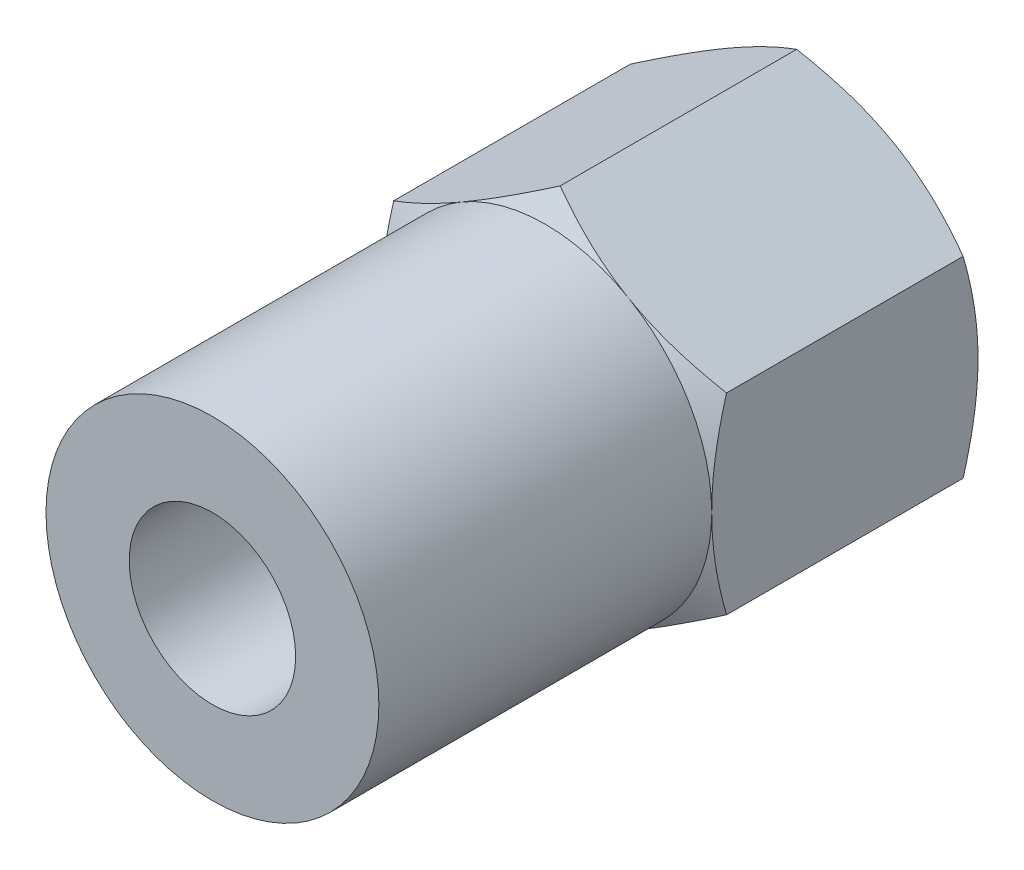
ISO-10303-21;
HEADER;
FILE_DESCRIPTION(('STEP AP214'),'2;1');
FILE_NAME('part.step','',(''),(''),'','','');
FILE_SCHEMA(('AUTOMOTIVE_DESIGN { 1 0 10303 214 1 1 1 1 }'));
ENDSEC;
DATA;
#1=APPLICATION_CONTEXT('core data for automotive mechanical design processes');
#2=APPLICATION_PROTOCOL_DEFINITION('international standard','automotive_design',2000,#1);
#3=PRODUCT_CONTEXT('',#1,'mechanical');
#4=PRODUCT('Part','Part','',(#3));
#5=PRODUCT_RELATED_PRODUCT_CATEGORY('part','',(#4));
#6=PRODUCT_DEFINITION_FORMATION('','',#4);
#7=PRODUCT_DEFINITION_CONTEXT('part definition',#1,'design');
#8=PRODUCT_DEFINITION('design','',#6,#7);
#9=PRODUCT_DEFINITION_SHAPE('','',#8);
#10=(LENGTH_UNIT() NAMED_UNIT(*) SI_UNIT(.MILLI.,.METRE.));
#11=(NAMED_UNIT(*) PLANE_ANGLE_UNIT() SI_UNIT($,.RADIAN.));
#12=(NAMED_UNIT(*) SI_UNIT($,.STERADIAN.) SOLID_ANGLE_UNIT());
#13=UNCERTAINTY_MEASURE_WITH_UNIT(LENGTH_MEASURE(1.E-05),#10,'distance_accuracy_value','');
#14=(GEOMETRIC_REPRESENTATION_CONTEXT(3) GLOBAL_UNCERTAINTY_ASSIGNED_CONTEXT((#13)) GLOBAL_UNIT_ASSIGNED_CONTEXT((#10,
#11,#12)) REPRESENTATION_CONTEXT('',''));
#15=CARTESIAN_POINT('',(0.,0.,0.));
#16=DIRECTION('',(0.,0.,1.));
#17=DIRECTION('',(1.,0.,0.));
#18=AXIS2_PLACEMENT_3D('',#15,#16,#17);
#19=CARTESIAN_POINT('',(2.5,1.44337567297407,4.));
#20=DIRECTION('',(-0.5,-0.866025403784439,0.));
#21=DIRECTION('',(0.866025403784439,-0.5,0.));
#22=AXIS2_PLACEMENT_3D('',#19,#20,#21);
#23=PLANE('',#22);
#24=DIRECTION('',(0.,0.,-1.));
#25=VECTOR('',#24,1.);
#26=CARTESIAN_POINT('',(2.5,1.44337567297407,4.));
#27=LINE('',#26,#25);
#28=CARTESIAN_POINT('',(2.5,1.44337567297407,3.7767090063074));
#29=VERTEX_POINT('',#28);
#30=CARTESIAN_POINT('',(2.5,1.44337567297407,0.223290993692598));
#31=VERTEX_POINT('',#30);
#32=EDGE_CURVE('E153',#29,#31,#27,.T.);
#33=ORIENTED_EDGE('',*,*,#32,.T.);
#34=CARTESIAN_POINT('',(2.5002,1.44326020292023,0.223357664359105));
#35=CARTESIAN_POINT('',(2.39033676526513,1.50668977106845,0.186721620107623));
#36=CARTESIAN_POINT('',(2.27952520010347,1.57066685804385,0.153402218965053));
#37=CARTESIAN_POINT('',(2.05598316653395,1.69972891130041,0.0952422855578558));
#38=CARTESIAN_POINT('',(1.94324872547161,1.7648161711947,0.0704223291477367));
#39=CARTESIAN_POINT('',(1.71917700612473,1.8941840386774,0.0317856514410509));
#40=CARTESIAN_POINT('',(1.60787420823262,1.95844473900197,0.0177117961856379));
#41=CARTESIAN_POINT('',(1.38474477253166,2.08726857876804,0.000909152352749485));
#42=CARTESIAN_POINT('',(1.27291894598577,2.15183124982667,-0.00183354879637389));
#43=CARTESIAN_POINT('',(1.06395802444848,2.27247489412634,0.00386576000805311));
#44=CARTESIAN_POINT('',(0.966791682442268,2.32857390783979,0.0109083943818612));
#45=CARTESIAN_POINT('',(0.773092050288996,2.44040644260542,0.0332314191249417));
#46=CARTESIAN_POINT('',(0.676559430340266,2.49613957671839,0.048519438440266));
#47=CARTESIAN_POINT('',(0.482460278259522,2.60820277442169,0.0867390938444189));
#48=CARTESIAN_POINT('',(0.384918318217858,2.66451865130903,0.109832776125515));
#49=CARTESIAN_POINT('',(0.191289391923913,2.77631036402774,0.162246656577911));
#50=CARTESIAN_POINT('',(0.0951999441138218,2.83178763258717,0.191554535624546));
#51=CARTESIAN_POINT('',(-0.000200000000002286,2.88686681600197,0.223357664359106));
#52=B_SPLINE_CURVE_WITH_KNOTS('',3,(#34,#35,#36,#37,#38,#39,#40,#41,#42,#43,#44,#45,#46,#47,#48,
#49,#50,#51),.UNSPECIFIED.,.F.,.F.,(4,2,2,2,2,2,2,2,4),(0.,0.396285827362226,0.793524330152049,
1.18093086852114,1.56786160134475,1.90479741793733,2.24204551660463,2.58677531536756,
2.93082800105256),.UNSPECIFIED.);
#53=CARTESIAN_POINT('',(1.25,2.1650635094611,0.));
#54=VERTEX_POINT('',#53);
#55=EDGE_CURVE('E53',#31,#54,#52,.T.);
#56=ORIENTED_EDGE('',*,*,#55,.T.);
#57=CARTESIAN_POINT('',(0.,2.88675134594813,0.223290993692599));
#58=VERTEX_POINT('',#57);
#59=EDGE_CURVE('E224',#54,#58,#52,.T.);
#60=ORIENTED_EDGE('',*,*,#59,.T.);
#61=DIRECTION('',(0.,0.,-1.));
#62=VECTOR('',#61,1.);
#63=CARTESIAN_POINT('',(0.,2.88675134594813,4.));
#64=LINE('',#63,#62);
#65=CARTESIAN_POINT('',(0.,2.88675134594813,3.7767090063074));
#66=VERTEX_POINT('',#65);
#67=EDGE_CURVE('E269',#66,#58,#64,.T.);
#68=ORIENTED_EDGE('',*,*,#67,.F.);
#69=CARTESIAN_POINT('',(-0.000200000000002395,2.88686681600197,3.77664233564089));
#70=CARTESIAN_POINT('',(0.109663234734869,2.82343724785375,3.81327837989238));
#71=CARTESIAN_POINT('',(0.220474799896523,2.75946016087834,3.84659778103495));
#72=CARTESIAN_POINT('',(0.444016833466047,2.63039810762178,3.90475771444214));
#73=CARTESIAN_POINT('',(0.556751274528385,2.5653108477275,3.92957767085226));
#74=CARTESIAN_POINT('',(0.780822993875266,2.43594298024479,3.96821434855895));
#75=CARTESIAN_POINT('',(0.892125791767374,2.37168227992023,3.98228820381436));
#76=CARTESIAN_POINT('',(1.11525522746833,2.24285844015415,3.99909084764725));
#77=CARTESIAN_POINT('',(1.22708105401422,2.17829576909553,4.00183354879637));
#78=CARTESIAN_POINT('',(1.43604197555152,2.05765212479586,3.99613423999195));
#79=CARTESIAN_POINT('',(1.53320831755773,2.0015531110824,3.98909160561814));
#80=CARTESIAN_POINT('',(1.726907949711,1.88972057631678,3.96676858087506));
#81=CARTESIAN_POINT('',(1.82344056965973,1.8339874422038,3.95148056155973));
#82=CARTESIAN_POINT('',(2.01753972174047,1.7219242445005,3.91326090615558));
#83=CARTESIAN_POINT('',(2.11508168178214,1.66560836761316,3.89016722387449));
#84=CARTESIAN_POINT('',(2.30871060807608,1.55381665489446,3.83775334342209));
#85=CARTESIAN_POINT('',(2.40480005588617,1.49833938633502,3.80844546437545));
#86=CARTESIAN_POINT('',(2.5002,1.44326020292023,3.77664233564089));
#87=B_SPLINE_CURVE_WITH_KNOTS('',3,(#69,#70,#71,#72,#73,#74,#75,#76,#77,#78,#79,#80,#81,#82,#83,
#84,#85,#86),.UNSPECIFIED.,.F.,.F.,(4,2,2,2,2,2,2,2,4),(0.,0.396285827362226,0.793524330152049,
1.18093086852114,1.56786160134475,1.90479741793733,2.24204551660463,2.58677531536756,
2.93082800105256),.UNSPECIFIED.);
#88=CARTESIAN_POINT('',(1.25,2.1650635094611,4.));
#89=VERTEX_POINT('',#88);
#90=EDGE_CURVE('E293',#66,#89,#87,.T.);
#91=ORIENTED_EDGE('',*,*,#90,.T.);
#92=EDGE_CURVE('E147',#89,#29,#87,.T.);
#93=ORIENTED_EDGE('',*,*,#92,.T.);
#94=EDGE_LOOP('',(#33,#56,#60,#68,#91,#93));
#95=FACE_BOUND('',#94,.T.);
#96=ADVANCED_FACE('F32',(#95),#23,.F.);
#97=CARTESIAN_POINT('',(0.,2.88675134594813,4.));
#98=DIRECTION('',(0.5,-0.866025403784439,0.));
#99=DIRECTION('',(0.866025403784439,0.5,0.));
#100=AXIS2_PLACEMENT_3D('',#97,#98,#99);
#101=PLANE('',#100);
#102=ORIENTED_EDGE('',*,*,#67,.T.);
#103=CARTESIAN_POINT('',(0.000199999999997659,2.88686681600197,0.223357664359106));
#104=CARTESIAN_POINT('',(-0.109663234734873,2.82343724785375,0.186721620107624));
#105=CARTESIAN_POINT('',(-0.220474799896528,2.75946016087834,0.153402218965055));
#106=CARTESIAN_POINT('',(-0.444016833466051,2.63039810762178,0.095242285557857));
#107=CARTESIAN_POINT('',(-0.55675127452839,2.5653108477275,0.0704223291477378));
#108=CARTESIAN_POINT('',(-0.78082299387527,2.43594298024479,0.031785651441052));
#109=CARTESIAN_POINT('',(-0.892125791767378,2.37168227992023,0.0177117961856391));
#110=CARTESIAN_POINT('',(-1.11525522746833,2.24285844015415,0.000909152352750564));
#111=CARTESIAN_POINT('',(-1.22708105401423,2.17829576909553,-0.00183354879637306));
#112=CARTESIAN_POINT('',(-1.43604197555152,2.05765212479586,0.0038657600080538));
#113=CARTESIAN_POINT('',(-1.53320831755773,2.0015531110824,0.0109083943818619));
#114=CARTESIAN_POINT('',(-1.726907949711,1.88972057631678,0.0332314191249424));
#115=CARTESIAN_POINT('',(-1.82344056965973,1.8339874422038,0.0485194384402668));
#116=CARTESIAN_POINT('',(-2.01753972174047,1.7219242445005,0.0867390938444195));
#117=CARTESIAN_POINT('',(-2.11508168178214,1.66560836761316,0.109832776125516));
#118=CARTESIAN_POINT('',(-2.30871060807608,1.55381665489446,0.162246656577911));
#119=CARTESIAN_POINT('',(-2.40480005588617,1.49833938633502,0.191554535624546));
#120=CARTESIAN_POINT('',(-2.5002,1.44326020292023,0.223357664359106));
#121=B_SPLINE_CURVE_WITH_KNOTS('',3,(#103,#104,#105,#106,#107,#108,#109,#110,#111,#112,#113,
#114,#115,#116,#117,#118,#119,#120),.UNSPECIFIED.,.F.,.F.,(4,2,2,2,2,2,2,2,4),(0.,
0.396285827362226,0.79352433015205,1.18093086852114,1.56786160134475,1.90479741793733,
2.24204551660462,2.58677531536756,2.93082800105256),.UNSPECIFIED.);
#122=CARTESIAN_POINT('',(-1.25,2.1650635094611,0.));
#123=VERTEX_POINT('',#122);
#124=EDGE_CURVE('E222',#58,#123,#121,.T.);
#125=ORIENTED_EDGE('',*,*,#124,.T.);
#126=CARTESIAN_POINT('',(-2.5,1.44337567297407,0.223290993692599));
#127=VERTEX_POINT('',#126);
#128=EDGE_CURVE('E217',#123,#127,#121,.T.);
#129=ORIENTED_EDGE('',*,*,#128,.T.);
#130=DIRECTION('',(0.,0.,-1.));
#131=VECTOR('',#130,1.);
#132=CARTESIAN_POINT('',(-2.5,1.44337567297407,4.));
#133=LINE('',#132,#131);
#134=CARTESIAN_POINT('',(-2.5,1.44337567297407,3.7767090063074));
#135=VERTEX_POINT('',#134);
#136=EDGE_CURVE('E266',#135,#127,#133,.T.);
#137=ORIENTED_EDGE('',*,*,#136,.F.);
#138=CARTESIAN_POINT('',(-2.5002,1.44326020292023,3.77664233564089));
#139=CARTESIAN_POINT('',(-2.39033676526513,1.50668977106845,3.81327837989238));
#140=CARTESIAN_POINT('',(-2.27952520010347,1.57066685804385,3.84659778103495));
#141=CARTESIAN_POINT('',(-2.05598316653395,1.69972891130041,3.90475771444214));
#142=CARTESIAN_POINT('',(-1.94324872547161,1.7648161711947,3.92957767085226));
#143=CARTESIAN_POINT('',(-1.71917700612473,1.8941840386774,3.96821434855895));
#144=CARTESIAN_POINT('',(-1.60787420823262,1.95844473900197,3.98228820381436));
#145=CARTESIAN_POINT('',(-1.38474477253167,2.08726857876804,3.99909084764725));
#146=CARTESIAN_POINT('',(-1.27291894598577,2.15183124982667,4.00183354879637));
#147=CARTESIAN_POINT('',(-1.06395802444848,2.27247489412634,3.99613423999195));
#148=CARTESIAN_POINT('',(-0.96679168244227,2.32857390783979,3.98909160561814));
#149=CARTESIAN_POINT('',(-0.773092050288999,2.44040644260542,3.96676858087506));
#150=CARTESIAN_POINT('',(-0.676559430340269,2.4961395767184,3.95148056155973));
#151=CARTESIAN_POINT('',(-0.482460278259526,2.60820277442169,3.91326090615558));
#152=CARTESIAN_POINT('',(-0.384918318217861,2.66451865130903,3.89016722387448));
#153=CARTESIAN_POINT('',(-0.191289391923917,2.77631036402774,3.83775334342209));
#154=CARTESIAN_POINT('',(-0.0951999441138267,2.83178763258717,3.80844546437545));
#155=CARTESIAN_POINT('',(0.000199999999997446,2.88686681600197,3.77664233564089));
#156=B_SPLINE_CURVE_WITH_KNOTS('',3,(#138,#139,#140,#141,#142,#143,#144,#145,#146,#147,#148,
#149,#150,#151,#152,#153,#154,#155),.UNSPECIFIED.,.F.,.F.,(4,2,2,2,2,2,2,2,4),(0.,
0.396285827362226,0.793524330152049,1.18093086852114,1.56786160134475,1.90479741793733,
2.24204551660462,2.58677531536756,2.93082800105256),.UNSPECIFIED.);
#157=CARTESIAN_POINT('',(-1.25,2.1650635094611,4.));
#158=VERTEX_POINT('',#157);
#159=EDGE_CURVE('E243',#135,#158,#156,.T.);
#160=ORIENTED_EDGE('',*,*,#159,.T.);
#161=EDGE_CURVE('E236',#158,#66,#156,.T.);
#162=ORIENTED_EDGE('',*,*,#161,.T.);
#163=EDGE_LOOP('',(#102,#125,#129,#137,#160,#162));
#164=FACE_BOUND('',#163,.T.);
#165=ADVANCED_FACE('F228',(#164),#101,.F.);
#166=CARTESIAN_POINT('',(-2.5,1.44337567297407,4.));
#167=DIRECTION('',(1.,0.,0.));
#168=DIRECTION('',(0.,1.,0.));
#169=AXIS2_PLACEMENT_3D('',#166,#167,#168);
#170=PLANE('',#169);
#171=ORIENTED_EDGE('',*,*,#136,.T.);
#172=CARTESIAN_POINT('',(-2.5,-3.82804588606159,1.19631719462706));
#173=CARTESIAN_POINT('',(-2.5,-3.71828171828268,1.1432730821246));
#174=CARTESIAN_POINT('',(-2.5,-3.60825803181684,1.0907562718294));
#175=CARTESIAN_POINT('',(-2.5,-3.38755129984202,0.987078574405219));
#176=CARTESIAN_POINT('',(-2.5,-3.27686814418247,0.935917922039251));
#177=CARTESIAN_POINT('',(-2.5,-3.05410425049089,0.834984342017556));
#178=CARTESIAN_POINT('',(-2.5,-2.94201913932292,0.785221031167754));
#179=CARTESIAN_POINT('',(-2.5,-2.71692767582903,0.687831863773547));
#180=CARTESIAN_POINT('',(-2.5,-2.60392137188689,0.640205895813446));
#181=CARTESIAN_POINT('',(-2.5,-2.37540490571202,0.547094350647382));
#182=CARTESIAN_POINT('',(-2.5,-2.25988103642781,0.501642229090351));
#183=CARTESIAN_POINT('',(-2.5,-2.02747068367306,0.414297786395571));
#184=CARTESIAN_POINT('',(-2.5,-1.91058405024255,0.37240586131129));
#185=CARTESIAN_POINT('',(-2.5,-1.67550228123859,0.293307436338151));
#186=CARTESIAN_POINT('',(-2.5,-1.55731053192955,0.256090975253657));
#187=CARTESIAN_POINT('',(-2.5,-1.31924678242158,0.187552148791344));
#188=CARTESIAN_POINT('',(-2.5,-1.19937532651053,0.156227919489701));
#189=CARTESIAN_POINT('',(-2.5,-0.957870273262473,0.100994259980165));
#190=CARTESIAN_POINT('',(-2.5,-0.836236215486563,0.0770868051605593));
#191=CARTESIAN_POINT('',(-2.5,-0.591501610534912,0.0382963836731118));
#192=CARTESIAN_POINT('',(-2.5,-0.468401062063662,0.0234134249781847));
#193=CARTESIAN_POINT('',(-2.5,-0.222157236207172,0.0039886185114247));
#194=CARTESIAN_POINT('',(-2.5,-0.0990192575787314,-0.000618696640384307));
#195=CARTESIAN_POINT('',(-2.5,0.147170473520896,0.000752554217982128));
#196=CARTESIAN_POINT('',(-2.5,0.270222240078052,0.00672837235162714));
#197=CARTESIAN_POINT('',(-2.5,0.480350939206174,0.0255492679731268));
#198=CARTESIAN_POINT('',(-2.5,0.567659694215581,0.035943381173778));
#199=CARTESIAN_POINT('',(-2.5,0.741602769794545,0.0613834779042062));
#200=CARTESIAN_POINT('',(-2.5,0.828236981787941,0.076430195083654));
#201=CARTESIAN_POINT('',(-2.5,1.08705718104797,0.127759568035471));
#202=CARTESIAN_POINT('',(-2.5,1.25802999101341,0.170218229281861));
#203=CARTESIAN_POINT('',(-2.5,1.5138647987597,0.243447939149863));
#204=CARTESIAN_POINT('',(-2.5,1.60006033398196,0.269821441407084));
#205=CARTESIAN_POINT('',(-2.5,1.77155175455055,0.325178116432773));
#206=CARTESIAN_POINT('',(-2.5,1.85684821570526,0.354159489224476));
#207=CARTESIAN_POINT('',(-2.5,2.02618480561257,0.414128853727964));
#208=CARTESIAN_POINT('',(-2.5,2.1102293034903,0.445104632651975));
#209=CARTESIAN_POINT('',(-2.5,2.27766622643299,0.508874299435799));
#210=CARTESIAN_POINT('',(-2.5,2.36105837219083,0.541668922113927));
#211=CARTESIAN_POINT('',(-2.5,2.44414899085243,0.575193481112136));
#212=B_SPLINE_CURVE_WITH_KNOTS('',3,(#172,#173,#174,#175,#176,#177,#178,#179,#180,#181,#182,
#183,#184,#185,#186,#187,#188,#189,#190,#191,#192,#193,#194,#195,#196,#197,#198,#199,#200,#201,
#202,#203,#204,#205,#206,#207,#208,#209,#210,#211),.UNSPECIFIED.,.F.,.F.,(4,2,2,2,2,2,2,2,2,2,2,
2,2,2,2,2,2,2,2,4),(0.,0.365732476934656,0.731527857346201,1.09941653761222,1.46728601819944,
1.83967179466915,2.2120989430543,2.58371866150581,2.95522062491226,3.32682144960045,
3.69842260258811,4.06764939320246,4.43678032932268,4.70042744974499,4.9641161647987,
5.49188604280506,5.76228478630216,6.03249830897404,6.30119088816194,6.56999282209528),.UNSPECIFIED.);
#213=CARTESIAN_POINT('',(-2.5,0.,0.));
#214=VERTEX_POINT('',#213);
#215=EDGE_CURVE('E223',#127,#214,#212,.F.);
#216=ORIENTED_EDGE('',*,*,#215,.T.);
#217=CARTESIAN_POINT('',(-2.5,-1.44337567297407,0.223290993692599));
#218=VERTEX_POINT('',#217);
#219=EDGE_CURVE('E211',#214,#218,#212,.F.);
#220=ORIENTED_EDGE('',*,*,#219,.T.);
#221=DIRECTION('',(0.,0.,-1.));
#222=VECTOR('',#221,1.);
#223=CARTESIAN_POINT('',(-2.5,-1.44337567297407,4.));
#224=LINE('',#223,#222);
#225=CARTESIAN_POINT('',(-2.5,-1.44337567297407,3.7767090063074));
#226=VERTEX_POINT('',#225);
#227=EDGE_CURVE('E263',#226,#218,#224,.T.);
#228=ORIENTED_EDGE('',*,*,#227,.F.);
#229=CARTESIAN_POINT('',(-2.5,-3.82804588606158,2.80368280537294));
#230=CARTESIAN_POINT('',(-2.5,-3.71828171828268,2.85672691787539));
#231=CARTESIAN_POINT('',(-2.5,-3.60825803181684,2.90924372817059));
#232=CARTESIAN_POINT('',(-2.5,-3.38755129984201,3.01292142559478));
#233=CARTESIAN_POINT('',(-2.5,-3.27686814418247,3.06408207796075));
#234=CARTESIAN_POINT('',(-2.5,-3.05410425049089,3.16501565798244));
#235=CARTESIAN_POINT('',(-2.5,-2.94201913932292,3.21477896883224));
#236=CARTESIAN_POINT('',(-2.5,-2.71692767582903,3.31216813622645));
#237=CARTESIAN_POINT('',(-2.5,-2.60392137188689,3.35979410418655));
#238=CARTESIAN_POINT('',(-2.5,-2.37540490571202,3.45290564935262));
#239=CARTESIAN_POINT('',(-2.5,-2.25988103642781,3.49835777090965));
#240=CARTESIAN_POINT('',(-2.5,-2.02747068367306,3.58570221360443));
#241=CARTESIAN_POINT('',(-2.5,-1.91058405024255,3.62759413868871));
#242=CARTESIAN_POINT('',(-2.5,-1.67550228123859,3.70669256366185));
#243=CARTESIAN_POINT('',(-2.5,-1.55731053192955,3.74390902474634));
#244=CARTESIAN_POINT('',(-2.5,-1.31924678242158,3.81244785120866));
#245=CARTESIAN_POINT('',(-2.5,-1.19937532651053,3.8437720805103));
#246=CARTESIAN_POINT('',(-2.5,-0.957870273262473,3.89900574001983));
#247=CARTESIAN_POINT('',(-2.5,-0.836236215486563,3.92291319483944));
#248=CARTESIAN_POINT('',(-2.5,-0.591501610534912,3.96170361632689));
#249=CARTESIAN_POINT('',(-2.5,-0.468401062063662,3.97658657502181));
#250=CARTESIAN_POINT('',(-2.5,-0.222157236207172,3.99601138148858));
#251=CARTESIAN_POINT('',(-2.5,-0.0990192575787313,4.00061869664038));
#252=CARTESIAN_POINT('',(-2.5,0.147170473520896,3.99924744578202));
#253=CARTESIAN_POINT('',(-2.5,0.270222240078052,3.99327162764837));
#254=CARTESIAN_POINT('',(-2.5,0.480350939206174,3.97445073202687));
#255=CARTESIAN_POINT('',(-2.5,0.567659694215581,3.96405661882622));
#256=CARTESIAN_POINT('',(-2.5,0.741602769794545,3.93861652209579));
#257=CARTESIAN_POINT('',(-2.5,0.828236981787941,3.92356980491635));
#258=CARTESIAN_POINT('',(-2.5,1.08705718104797,3.87224043196453));
#259=CARTESIAN_POINT('',(-2.5,1.25802999101341,3.82978177071814));
#260=CARTESIAN_POINT('',(-2.5,1.5138647987597,3.75655206085014));
#261=CARTESIAN_POINT('',(-2.5,1.60006033398196,3.73017855859292));
#262=CARTESIAN_POINT('',(-2.5,1.77155175455055,3.67482188356723));
#263=CARTESIAN_POINT('',(-2.5,1.85684821570526,3.64584051077552));
#264=CARTESIAN_POINT('',(-2.5,2.02618480561257,3.58587114627204));
#265=CARTESIAN_POINT('',(-2.5,2.1102293034903,3.55489536734802));
#266=CARTESIAN_POINT('',(-2.5,2.27766622643299,3.4911257005642));
#267=CARTESIAN_POINT('',(-2.5,2.36105837219083,3.45833107788607));
#268=CARTESIAN_POINT('',(-2.5,2.44414899085242,3.42480651888787));
#269=B_SPLINE_CURVE_WITH_KNOTS('',3,(#229,#230,#231,#232,#233,#234,#235,#236,#237,#238,#239,
#240,#241,#242,#243,#244,#245,#246,#247,#248,#249,#250,#251,#252,#253,#254,#255,#256,#257,#258,
#259,#260,#261,#262,#263,#264,#265,#266,#267,#268),.UNSPECIFIED.,.F.,.F.,(4,2,2,2,2,2,2,2,2,2,2,
2,2,2,2,2,2,2,2,4),(0.,0.365732476934656,0.731527857346201,1.09941653761222,1.46728601819944,
1.83967179466915,2.2120989430543,2.58371866150581,2.95522062491227,3.32682144960045,
3.69842260258811,4.06764939320246,4.43678032932268,4.70042744974499,4.9641161647987,
5.49188604280506,5.76228478630216,6.03249830897404,6.30119088816194,6.56999282209528),.UNSPECIFIED.);
#270=CARTESIAN_POINT('',(-2.5,0.,4.));
#271=VERTEX_POINT('',#270);
#272=EDGE_CURVE('E254',#226,#271,#269,.T.);
#273=ORIENTED_EDGE('',*,*,#272,.T.);
#274=EDGE_CURVE('E248',#271,#135,#269,.T.);
#275=ORIENTED_EDGE('',*,*,#274,.T.);
#276=EDGE_LOOP('',(#171,#216,#220,#228,#273,#275));
#277=FACE_BOUND('',#276,.T.);
#278=ADVANCED_FACE('F231',(#277),#170,.F.);
#279=CARTESIAN_POINT('',(-2.5,-1.44337567297407,4.));
#280=DIRECTION('',(0.5,0.866025403784439,0.));
#281=DIRECTION('',(-0.866025403784439,0.5,0.));
#282=AXIS2_PLACEMENT_3D('',#279,#280,#281);
#283=PLANE('',#282);
#284=ORIENTED_EDGE('',*,*,#227,.T.);
#285=CARTESIAN_POINT('',(-2.5002,-1.44326020292023,0.223357664359105));
#286=CARTESIAN_POINT('',(-2.39033676526513,-1.50668977106845,0.186721620107623));
#287=CARTESIAN_POINT('',(-2.27952520010347,-1.57066685804385,0.153402218965054));
#288=CARTESIAN_POINT('',(-2.05598316653395,-1.69972891130041,0.0952422855578565));
#289=CARTESIAN_POINT('',(-1.94324872547161,-1.7648161711947,0.0704223291477373));
#290=CARTESIAN_POINT('',(-1.71917700612473,-1.8941840386774,0.0317856514410514));
#291=CARTESIAN_POINT('',(-1.60787420823262,-1.95844473900197,0.0177117961856385));
#292=CARTESIAN_POINT('',(-1.38474477253167,-2.08726857876804,0.000909152352749903));
#293=CARTESIAN_POINT('',(-1.27291894598577,-2.15183124982667,-0.0018335487963737));
#294=CARTESIAN_POINT('',(-1.06395802444848,-2.27247489412634,0.00386576000805299));
#295=CARTESIAN_POINT('',(-0.96679168244227,-2.32857390783979,0.0109083943818609));
#296=CARTESIAN_POINT('',(-0.773092050288998,-2.44040644260542,0.0332314191249414));
#297=CARTESIAN_POINT('',(-0.676559430340268,-2.49613957671839,0.0485194384402658));
#298=CARTESIAN_POINT('',(-0.482460278259525,-2.60820277442169,0.0867390938444186));
#299=CARTESIAN_POINT('',(-0.38491831821786,-2.66451865130903,0.109832776125515));
#300=CARTESIAN_POINT('',(-0.191289391923915,-2.77631036402774,0.162246656577911));
#301=CARTESIAN_POINT('',(-0.0951999441138243,-2.83178763258717,0.191554535624546));
#302=CARTESIAN_POINT('',(0.000199999999999764,-2.88686681600197,0.223357664359105));
#303=B_SPLINE_CURVE_WITH_KNOTS('',3,(#285,#286,#287,#288,#289,#290,#291,#292,#293,#294,#295,
#296,#297,#298,#299,#300,#301,#302),.UNSPECIFIED.,.F.,.F.,(4,2,2,2,2,2,2,2,4),(0.,
0.396285827362226,0.793524330152049,1.18093086852114,1.56786160134475,1.90479741793733,
2.24204551660463,2.58677531536756,2.93082800105256),.UNSPECIFIED.);
#304=CARTESIAN_POINT('',(-1.25,-2.1650635094611,0.));
#305=VERTEX_POINT('',#304);
#306=EDGE_CURVE('E320',#218,#305,#303,.T.);
#307=ORIENTED_EDGE('',*,*,#306,.T.);
#308=CARTESIAN_POINT('',(0.,-2.88675134594813,0.223290993692599));
#309=VERTEX_POINT('',#308);
#310=EDGE_CURVE('E206',#305,#309,#303,.T.);
#311=ORIENTED_EDGE('',*,*,#310,.T.);
#312=DIRECTION('',(0.,0.,-1.));
#313=VECTOR('',#312,1.);
#314=CARTESIAN_POINT('',(0.,-2.88675134594813,4.));
#315=LINE('',#314,#313);
#316=CARTESIAN_POINT('',(0.,-2.88675134594813,3.7767090063074));
#317=VERTEX_POINT('',#316);
#318=EDGE_CURVE('E260',#317,#309,#315,.T.);
#319=ORIENTED_EDGE('',*,*,#318,.F.);
#320=CARTESIAN_POINT('',(0.000199999999999845,-2.88686681600197,3.77664233564089));
#321=CARTESIAN_POINT('',(-0.109663234734871,-2.82343724785375,3.81327837989238));
#322=CARTESIAN_POINT('',(-0.220474799896526,-2.75946016087834,3.84659778103495));
#323=CARTESIAN_POINT('',(-0.444016833466049,-2.63039810762178,3.90475771444214));
#324=CARTESIAN_POINT('',(-0.556751274528388,-2.5653108477275,3.92957767085226));
#325=CARTESIAN_POINT('',(-0.780822993875268,-2.43594298024479,3.96821434855895));
#326=CARTESIAN_POINT('',(-0.892125791767376,-2.37168227992023,3.98228820381436));
#327=CARTESIAN_POINT('',(-1.11525522746833,-2.24285844015415,3.99909084764725));
#328=CARTESIAN_POINT('',(-1.22708105401423,-2.17829576909553,4.00183354879637));
#329=CARTESIAN_POINT('',(-1.43604197555152,-2.05765212479586,3.99613423999195));
#330=CARTESIAN_POINT('',(-1.53320831755773,-2.0015531110824,3.98909160561814));
#331=CARTESIAN_POINT('',(-1.726907949711,-1.88972057631678,3.96676858087506));
#332=CARTESIAN_POINT('',(-1.82344056965973,-1.8339874422038,3.95148056155973));
#333=CARTESIAN_POINT('',(-2.01753972174048,-1.7219242445005,3.91326090615558));
#334=CARTESIAN_POINT('',(-2.11508168178214,-1.66560836761316,3.89016722387448));
#335=CARTESIAN_POINT('',(-2.30871060807608,-1.55381665489446,3.83775334342209));
#336=CARTESIAN_POINT('',(-2.40480005588618,-1.49833938633502,3.80844546437545));
#337=CARTESIAN_POINT('',(-2.5002,-1.44326020292023,3.77664233564089));
#338=B_SPLINE_CURVE_WITH_KNOTS('',3,(#320,#321,#322,#323,#324,#325,#326,#327,#328,#329,#330,
#331,#332,#333,#334,#335,#336,#337),.UNSPECIFIED.,.F.,.F.,(4,2,2,2,2,2,2,2,4),(0.,
0.396285827362226,0.79352433015205,1.18093086852114,1.56786160134475,1.90479741793733,
2.24204551660463,2.58677531536756,2.93082800105256),.UNSPECIFIED.);
#339=CARTESIAN_POINT('',(-1.25,-2.1650635094611,4.));
#340=VERTEX_POINT('',#339);
#341=EDGE_CURVE('E244',#317,#340,#338,.T.);
#342=ORIENTED_EDGE('',*,*,#341,.T.);
#343=EDGE_CURVE('E255',#340,#226,#338,.T.);
#344=ORIENTED_EDGE('',*,*,#343,.T.);
#345=EDGE_LOOP('',(#284,#307,#311,#319,#342,#344));
#346=FACE_BOUND('',#345,.T.);
#347=ADVANCED_FACE('F288',(#346),#283,.F.);
#348=CARTESIAN_POINT('',(0.,-2.88675134594813,4.));
#349=DIRECTION('',(-0.5,0.866025403784439,0.));
#350=DIRECTION('',(-0.866025403784439,-0.5,0.));
#351=AXIS2_PLACEMENT_3D('',#348,#349,#350);
#352=PLANE('',#351);
#353=ORIENTED_EDGE('',*,*,#318,.T.);
#354=CARTESIAN_POINT('',(-0.000200000000000208,-2.88686681600197,0.223357664359105));
#355=CARTESIAN_POINT('',(0.109663234734871,-2.82343724785375,0.186721620107624));
#356=CARTESIAN_POINT('',(0.220474799896525,-2.75946016087834,0.153402218965054));
#357=CARTESIAN_POINT('',(0.444016833466049,-2.63039810762178,0.0952422855578566));
#358=CARTESIAN_POINT('',(0.556751274528387,-2.5653108477275,0.0704223291477374));
#359=CARTESIAN_POINT('',(0.780822993875268,-2.43594298024479,0.0317856514410516));
#360=CARTESIAN_POINT('',(0.892125791767376,-2.37168227992023,0.0177117961856386));
#361=CARTESIAN_POINT('',(1.11525522746833,-2.24285844015415,0.000909152352749952));
#362=CARTESIAN_POINT('',(1.22708105401422,-2.17829576909553,-0.00183354879637372));
#363=CARTESIAN_POINT('',(1.43604197555152,-2.05765212479586,0.00386576000805314));
#364=CARTESIAN_POINT('',(1.53320831755773,-2.0015531110824,0.0109083943818613));
#365=CARTESIAN_POINT('',(1.726907949711,-1.88972057631678,0.0332314191249417));
#366=CARTESIAN_POINT('',(1.82344056965973,-1.8339874422038,0.0485194384402658));
#367=CARTESIAN_POINT('',(2.01753972174047,-1.7219242445005,0.0867390938444184));
#368=CARTESIAN_POINT('',(2.11508168178214,-1.66560836761317,0.109832776125515));
#369=CARTESIAN_POINT('',(2.30871060807608,-1.55381665489446,0.16224665657791));
#370=CARTESIAN_POINT('',(2.40480005588617,-1.49833938633502,0.191554535624545));
#371=CARTESIAN_POINT('',(2.5002,-1.44326020292023,0.223357664359105));
#372=B_SPLINE_CURVE_WITH_KNOTS('',3,(#354,#355,#356,#357,#358,#359,#360,#361,#362,#363,#364,
#365,#366,#367,#368,#369,#370,#371),.UNSPECIFIED.,.F.,.F.,(4,2,2,2,2,2,2,2,4),(0.,
0.396285827362226,0.793524330152049,1.18093086852114,1.56786160134475,1.90479741793733,
2.24204551660463,2.58677531536756,2.93082800105256),.UNSPECIFIED.);
#373=CARTESIAN_POINT('',(1.25,-2.1650635094611,0.));
#374=VERTEX_POINT('',#373);
#375=EDGE_CURVE('E322',#309,#374,#372,.T.);
#376=ORIENTED_EDGE('',*,*,#375,.T.);
#377=CARTESIAN_POINT('',(2.5,-1.44337567297407,0.223290993692599));
#378=VERTEX_POINT('',#377);
#379=EDGE_CURVE('E189',#374,#378,#372,.T.);
#380=ORIENTED_EDGE('',*,*,#379,.T.);
#381=DIRECTION('',(0.,0.,-1.));
#382=VECTOR('',#381,1.);
#383=CARTESIAN_POINT('',(2.5,-1.44337567297407,4.));
#384=LINE('',#383,#382);
#385=CARTESIAN_POINT('',(2.5,-1.44337567297407,3.7767090063074));
#386=VERTEX_POINT('',#385);
#387=EDGE_CURVE('E257',#386,#378,#384,.T.);
#388=ORIENTED_EDGE('',*,*,#387,.F.);
#389=CARTESIAN_POINT('',(2.5002,-1.44326020292023,3.77664233564089));
#390=CARTESIAN_POINT('',(2.39033676526513,-1.50668977106845,3.81327837989238));
#391=CARTESIAN_POINT('',(2.27952520010347,-1.57066685804385,3.84659778103495));
#392=CARTESIAN_POINT('',(2.05598316653395,-1.69972891130042,3.90475771444214));
#393=CARTESIAN_POINT('',(1.94324872547161,-1.7648161711947,3.92957767085226));
#394=CARTESIAN_POINT('',(1.71917700612473,-1.8941840386774,3.96821434855895));
#395=CARTESIAN_POINT('',(1.60787420823262,-1.95844473900197,3.98228820381436));
#396=CARTESIAN_POINT('',(1.38474477253166,-2.08726857876805,3.99909084764725));
#397=CARTESIAN_POINT('',(1.27291894598577,-2.15183124982667,4.00183354879637));
#398=CARTESIAN_POINT('',(1.06395802444848,-2.27247489412634,3.99613423999195));
#399=CARTESIAN_POINT('',(0.966791682442268,-2.32857390783979,3.98909160561814));
#400=CARTESIAN_POINT('',(0.773092050288996,-2.44040644260542,3.96676858087506));
#401=CARTESIAN_POINT('',(0.676559430340267,-2.4961395767184,3.95148056155973));
#402=CARTESIAN_POINT('',(0.482460278259523,-2.60820277442169,3.91326090615558));
#403=CARTESIAN_POINT('',(0.384918318217859,-2.66451865130903,3.89016722387448));
#404=CARTESIAN_POINT('',(0.191289391923914,-2.77631036402774,3.83775334342209));
#405=CARTESIAN_POINT('',(0.0951999441138233,-2.83178763258718,3.80844546437545));
#406=CARTESIAN_POINT('',(-0.000200000000000566,-2.88686681600197,3.77664233564089));
#407=B_SPLINE_CURVE_WITH_KNOTS('',3,(#389,#390,#391,#392,#393,#394,#395,#396,#397,#398,#399,
#400,#401,#402,#403,#404,#405,#406),.UNSPECIFIED.,.F.,.F.,(4,2,2,2,2,2,2,2,4),(0.,
0.396285827362226,0.793524330152049,1.18093086852114,1.56786160134475,1.90479741793733,
2.24204551660463,2.58677531536756,2.93082800105256),.UNSPECIFIED.);
#408=CARTESIAN_POINT('',(1.25,-2.1650635094611,4.));
#409=VERTEX_POINT('',#408);
#410=EDGE_CURVE('E136',#386,#409,#407,.T.);
#411=ORIENTED_EDGE('',*,*,#410,.T.);
#412=EDGE_CURVE('E155',#409,#317,#407,.T.);
#413=ORIENTED_EDGE('',*,*,#412,.T.);
#414=EDGE_LOOP('',(#353,#376,#380,#388,#411,#413));
#415=FACE_BOUND('',#414,.T.);
#416=ADVANCED_FACE('F175',(#415),#352,.F.);
#417=CARTESIAN_POINT('',(2.5,-1.44337567297407,4.));
#418=DIRECTION('',(-1.,0.,0.));
#419=DIRECTION('',(0.,-1.,0.));
#420=AXIS2_PLACEMENT_3D('',#417,#418,#419);
#421=PLANE('',#420);
#422=ORIENTED_EDGE('',*,*,#387,.T.);
#423=CARTESIAN_POINT('',(2.5,-3.82804588606158,1.19631719462706));
#424=CARTESIAN_POINT('',(2.5,-3.71828171828268,1.1432730821246));
#425=CARTESIAN_POINT('',(2.5,-3.60825803181684,1.0907562718294));
#426=CARTESIAN_POINT('',(2.5,-3.38755129984202,0.987078574405218));
#427=CARTESIAN_POINT('',(2.5,-3.27686814418247,0.93591792203925));
#428=CARTESIAN_POINT('',(2.5,-3.05410425049089,0.834984342017555));
#429=CARTESIAN_POINT('',(2.5,-2.94201913932292,0.785221031167754));
#430=CARTESIAN_POINT('',(2.5,-2.71692767582903,0.687831863773546));
#431=CARTESIAN_POINT('',(2.5,-2.60392137188689,0.640205895813445));
#432=CARTESIAN_POINT('',(2.5,-2.37540490571202,0.547094350647381));
#433=CARTESIAN_POINT('',(2.5,-2.25988103642781,0.50164222909035));
#434=CARTESIAN_POINT('',(2.5,-2.02747068367306,0.414297786395571));
#435=CARTESIAN_POINT('',(2.5,-1.91058405024255,0.372405861311289));
#436=CARTESIAN_POINT('',(2.5,-1.67550228123859,0.29330743633815));
#437=CARTESIAN_POINT('',(2.5,-1.55731053192955,0.256090975253656));
#438=CARTESIAN_POINT('',(2.5,-1.31924678242158,0.187552148791343));
#439=CARTESIAN_POINT('',(2.5,-1.19937532651053,0.1562279194897));
#440=CARTESIAN_POINT('',(2.5,-0.957870273262475,0.100994259980164));
#441=CARTESIAN_POINT('',(2.5,-0.836236215486564,0.0770868051605582));
#442=CARTESIAN_POINT('',(2.5,-0.591501610534914,0.0382963836731108));
#443=CARTESIAN_POINT('',(2.5,-0.468401062063664,0.0234134249781837));
#444=CARTESIAN_POINT('',(2.5,-0.222157236207174,0.00398861851142364));
#445=CARTESIAN_POINT('',(2.5,-0.0990192575787329,-0.000618696640385512));
#446=CARTESIAN_POINT('',(2.5,0.147170473520894,0.00075255421798091));
#447=CARTESIAN_POINT('',(2.5,0.27022224007805,0.00672837235162602));
#448=CARTESIAN_POINT('',(2.5,0.480350939206171,0.0255492679731254));
#449=CARTESIAN_POINT('',(2.5,0.567659694215578,0.0359433811737764));
#450=CARTESIAN_POINT('',(2.5,0.741602769794543,0.0613834779042044));
#451=CARTESIAN_POINT('',(2.5,0.828236981787938,0.0764301950836522));
#452=CARTESIAN_POINT('',(2.5,1.08705718104796,0.127759568035469));
#453=CARTESIAN_POINT('',(2.5,1.2580299910134,0.170218229281859));
#454=CARTESIAN_POINT('',(2.5,1.5138647987597,0.24344793914986));
#455=CARTESIAN_POINT('',(2.5,1.60006033398196,0.269821441407082));
#456=CARTESIAN_POINT('',(2.5,1.77155175455055,0.325178116432771));
#457=CARTESIAN_POINT('',(2.5,1.85684821570526,0.354159489224474));
#458=CARTESIAN_POINT('',(2.5,2.02618480561257,0.414128853727962));
#459=CARTESIAN_POINT('',(2.5,2.1102293034903,0.445104632651973));
#460=CARTESIAN_POINT('',(2.5,2.27766622643299,0.508874299435797));
#461=CARTESIAN_POINT('',(2.5,2.36105837219083,0.541668922113925));
#462=CARTESIAN_POINT('',(2.5,2.44414899085242,0.575193481112133));
#463=B_SPLINE_CURVE_WITH_KNOTS('',3,(#423,#424,#425,#426,#427,#428,#429,#430,#431,#432,#433,
#434,#435,#436,#437,#438,#439,#440,#441,#442,#443,#444,#445,#446,#447,#448,#449,#450,#451,#452,
#453,#454,#455,#456,#457,#458,#459,#460,#461,#462),.UNSPECIFIED.,.F.,.F.,(4,2,2,2,2,2,2,2,2,2,2,
2,2,2,2,2,2,2,2,4),(0.,0.365732476934656,0.7315278573462,1.09941653761222,1.46728601819944,
1.83967179466915,2.2120989430543,2.58371866150581,2.95522062491226,3.32682144960045,
3.69842260258811,4.06764939320246,4.43678032932268,4.70042744974499,4.9641161647987,
5.49188604280506,5.76228478630216,6.03249830897403,6.30119088816194,6.56999282209528),.UNSPECIFIED.);
#464=CARTESIAN_POINT('',(2.5,0.,0.));
#465=VERTEX_POINT('',#464);
#466=EDGE_CURVE('E186',#378,#465,#463,.T.);
#467=ORIENTED_EDGE('',*,*,#466,.T.);
#468=EDGE_CURVE('E180',#465,#31,#463,.T.);
#469=ORIENTED_EDGE('',*,*,#468,.T.);
#470=ORIENTED_EDGE('',*,*,#32,.F.);
#471=CARTESIAN_POINT('',(2.5,-3.82804588606159,2.80368280537294));
#472=CARTESIAN_POINT('',(2.5,-3.71828171828268,2.85672691787539));
#473=CARTESIAN_POINT('',(2.5,-3.60825803181684,2.90924372817059));
#474=CARTESIAN_POINT('',(2.5,-3.38755129984202,3.01292142559478));
#475=CARTESIAN_POINT('',(2.5,-3.27686814418247,3.06408207796075));
#476=CARTESIAN_POINT('',(2.5,-3.05410425049089,3.16501565798244));
#477=CARTESIAN_POINT('',(2.5,-2.94201913932292,3.21477896883224));
#478=CARTESIAN_POINT('',(2.5,-2.71692767582903,3.31216813622645));
#479=CARTESIAN_POINT('',(2.5,-2.60392137188689,3.35979410418655));
#480=CARTESIAN_POINT('',(2.5,-2.37540490571202,3.45290564935262));
#481=CARTESIAN_POINT('',(2.5,-2.25988103642781,3.49835777090965));
#482=CARTESIAN_POINT('',(2.5,-2.02747068367307,3.58570221360443));
#483=CARTESIAN_POINT('',(2.5,-1.91058405024255,3.62759413868871));
#484=CARTESIAN_POINT('',(2.5,-1.6755022812386,3.70669256366185));
#485=CARTESIAN_POINT('',(2.5,-1.55731053192955,3.74390902474634));
#486=CARTESIAN_POINT('',(2.5,-1.31924678242158,3.81244785120866));
#487=CARTESIAN_POINT('',(2.5,-1.19937532651053,3.8437720805103));
#488=CARTESIAN_POINT('',(2.5,-0.957870273262475,3.89900574001984));
#489=CARTESIAN_POINT('',(2.5,-0.836236215486565,3.92291319483944));
#490=CARTESIAN_POINT('',(2.5,-0.591501610534914,3.96170361632689));
#491=CARTESIAN_POINT('',(2.5,-0.468401062063664,3.97658657502182));
#492=CARTESIAN_POINT('',(2.5,-0.222157236207174,3.99601138148858));
#493=CARTESIAN_POINT('',(2.5,-0.0990192575787326,4.00061869664039));
#494=CARTESIAN_POINT('',(2.5,0.147170473520894,3.99924744578202));
#495=CARTESIAN_POINT('',(2.5,0.270222240078051,3.99327162764837));
#496=CARTESIAN_POINT('',(2.5,0.480350939206172,3.97445073202687));
#497=CARTESIAN_POINT('',(2.5,0.567659694215579,3.96405661882622));
#498=CARTESIAN_POINT('',(2.5,0.741602769794542,3.9386165220958));
#499=CARTESIAN_POINT('',(2.5,0.828236981787938,3.92356980491635));
#500=CARTESIAN_POINT('',(2.5,1.08705718104796,3.87224043196453));
#501=CARTESIAN_POINT('',(2.5,1.2580299910134,3.82978177071814));
#502=CARTESIAN_POINT('',(2.5,1.5138647987597,3.75655206085014));
#503=CARTESIAN_POINT('',(2.5,1.60006033398195,3.73017855859292));
#504=CARTESIAN_POINT('',(2.5,1.77155175455055,3.67482188356723));
#505=CARTESIAN_POINT('',(2.5,1.85684821570526,3.64584051077553));
#506=CARTESIAN_POINT('',(2.5,2.02618480561256,3.58587114627204));
#507=CARTESIAN_POINT('',(2.5,2.1102293034903,3.55489536734803));
#508=CARTESIAN_POINT('',(2.5,2.27766622643299,3.4911257005642));
#509=CARTESIAN_POINT('',(2.5,2.36105837219083,3.45833107788608));
#510=CARTESIAN_POINT('',(2.5,2.44414899085242,3.42480651888787));
#511=B_SPLINE_CURVE_WITH_KNOTS('',3,(#471,#472,#473,#474,#475,#476,#477,#478,#479,#480,#481,
#482,#483,#484,#485,#486,#487,#488,#489,#490,#491,#492,#493,#494,#495,#496,#497,#498,#499,#500,
#501,#502,#503,#504,#505,#506,#507,#508,#509,#510),.UNSPECIFIED.,.F.,.F.,(4,2,2,2,2,2,2,2,2,2,2,
2,2,2,2,2,2,2,2,4),(0.,0.365732476934656,0.7315278573462,1.09941653761222,1.46728601819944,
1.83967179466915,2.2120989430543,2.58371866150581,2.95522062491226,3.32682144960045,
3.69842260258811,4.06764939320246,4.43678032932268,4.70042744974499,4.9641161647987,
5.49188604280506,5.76228478630216,6.03249830897403,6.30119088816194,6.56999282209527),.UNSPECIFIED.);
#512=CARTESIAN_POINT('',(2.5,0.,4.));
#513=VERTEX_POINT('',#512);
#514=EDGE_CURVE('E141',#29,#513,#511,.F.);
#515=ORIENTED_EDGE('',*,*,#514,.T.);
#516=EDGE_CURVE('E134',#513,#386,#511,.F.);
#517=ORIENTED_EDGE('',*,*,#516,.T.);
#518=EDGE_LOOP('',(#422,#467,#469,#470,#515,#517));
#519=FACE_BOUND('',#518,.T.);
#520=ADVANCED_FACE('F151',(#519),#421,.F.);
#521=CARTESIAN_POINT('',(0.,2.88675134594813,0.));
#522=DIRECTION('',(0.,0.,1.));
#523=DIRECTION('',(1.,0.,0.));
#524=AXIS2_PLACEMENT_3D('',#521,#522,#523);
#525=PLANE('',#524);
#526=CARTESIAN_POINT('',(0.,0.,0.));
#527=DIRECTION('',(0.,0.,1.));
#528=DIRECTION('',(1.,0.,0.));
#529=AXIS2_PLACEMENT_3D('',#526,#527,#528);
#530=CIRCLE('',#529,1.25);
#531=CARTESIAN_POINT('',(1.25,0.,0.));
#532=VERTEX_POINT('',#531);
#533=EDGE_CURVE('E258',#532,#532,#530,.T.);
#534=ORIENTED_EDGE('',*,*,#533,.T.);
#535=EDGE_LOOP('',(#534));
#536=FACE_BOUND('',#535,.T.);
#537=CARTESIAN_POINT('',(0.,0.,0.));
#538=DIRECTION('',(0.,0.,-1.));
#539=DIRECTION('',(0.,1.,0.));
#540=AXIS2_PLACEMENT_3D('',#537,#538,#539);
#541=CIRCLE('',#540,2.5);
#542=EDGE_CURVE('E187',#54,#465,#541,.T.);
#543=ORIENTED_EDGE('',*,*,#542,.T.);
#544=CARTESIAN_POINT('',(0.,0.,0.));
#545=DIRECTION('',(0.,0.,1.));
#546=DIRECTION('',(1.,0.,0.));
#547=AXIS2_PLACEMENT_3D('',#544,#545,#546);
#548=CIRCLE('',#547,2.5);
#549=EDGE_CURVE('E11',#465,#374,#548,.F.);
#550=ORIENTED_EDGE('',*,*,#549,.T.);
#551=EDGE_CURVE('E40',#374,#305,#548,.F.);
#552=ORIENTED_EDGE('',*,*,#551,.T.);
#553=EDGE_CURVE('E313',#305,#214,#548,.F.);
#554=ORIENTED_EDGE('',*,*,#553,.T.);
#555=EDGE_CURVE('E308',#214,#123,#548,.F.);
#556=ORIENTED_EDGE('',*,*,#555,.T.);
#557=EDGE_CURVE('E41',#123,#54,#548,.F.);
#558=ORIENTED_EDGE('',*,*,#557,.T.);
#559=EDGE_LOOP('',(#543,#550,#552,#554,#556,#558));
#560=FACE_BOUND('',#559,.T.);
#561=ADVANCED_FACE('F174',(#536,#560),#525,.F.);
#562=CARTESIAN_POINT('',(0.,0.,4.));
#563=DIRECTION('',(0.,0.,1.));
#564=DIRECTION('',(1.,0.,0.));
#565=AXIS2_PLACEMENT_3D('',#562,#563,#564);
#566=CYLINDRICAL_SURFACE('',#565,1.25);
#567=ORIENTED_EDGE('',*,*,#533,.F.);
#568=EDGE_LOOP('',(#567));
#569=FACE_BOUND('',#568,.T.);
#570=CARTESIAN_POINT('',(0.,0.,9.));
#571=DIRECTION('',(0.,0.,1.));
#572=DIRECTION('',(1.,0.,0.));
#573=AXIS2_PLACEMENT_3D('',#570,#571,#572);
#574=CIRCLE('',#573,1.25);
#575=CARTESIAN_POINT('',(1.25,0.,9.));
#576=VERTEX_POINT('',#575);
#577=EDGE_CURVE('E513',#576,#576,#574,.T.);
#578=ORIENTED_EDGE('',*,*,#577,.T.);
#579=EDGE_LOOP('',(#578));
#580=FACE_BOUND('',#579,.T.);
#581=ADVANCED_FACE('F367',(#569,#580),#566,.F.);
#582=CARTESIAN_POINT('',(0.,0.,4.));
#583=DIRECTION('',(0.,0.,-1.));
#584=DIRECTION('',(0.,1.,0.));
#585=AXIS2_PLACEMENT_3D('',#582,#583,#584);
#586=CONICAL_SURFACE('',#585,2.5,1.0471975511966);
#587=CARTESIAN_POINT('',(0.,0.,4.));
#588=DIRECTION('',(0.,0.,-1.));
#589=DIRECTION('',(0.,1.,0.));
#590=AXIS2_PLACEMENT_3D('',#587,#588,#589);
#591=CIRCLE('',#590,2.5);
#592=EDGE_CURVE('E125',#89,#513,#591,.T.);
#593=ORIENTED_EDGE('',*,*,#592,.T.);
#594=ORIENTED_EDGE('',*,*,#514,.F.);
#595=ORIENTED_EDGE('',*,*,#92,.F.);
#596=EDGE_LOOP('',(#593,#594,#595));
#597=FACE_BOUND('',#596,.T.);
#598=ADVANCED_FACE('F145',(#597),#586,.T.);
#599=CARTESIAN_POINT('',(0.,0.,4.));
#600=DIRECTION('',(0.,0.,1.));
#601=DIRECTION('',(1.,0.,0.));
#602=AXIS2_PLACEMENT_3D('',#599,#600,#601);
#603=CIRCLE('',#602,2.5);
#604=EDGE_CURVE('E132',#158,#89,#603,.F.);
#605=ORIENTED_EDGE('',*,*,#604,.T.);
#606=ORIENTED_EDGE('',*,*,#90,.F.);
#607=ORIENTED_EDGE('',*,*,#161,.F.);
#608=EDGE_LOOP('',(#605,#606,#607));
#609=FACE_BOUND('',#608,.T.);
#610=ADVANCED_FACE('F379',(#609),#586,.T.);
#611=EDGE_CURVE('E509',#271,#158,#603,.F.);
#612=ORIENTED_EDGE('',*,*,#611,.T.);
#613=ORIENTED_EDGE('',*,*,#159,.F.);
#614=ORIENTED_EDGE('',*,*,#274,.F.);
#615=EDGE_LOOP('',(#612,#613,#614));
#616=FACE_BOUND('',#615,.T.);
#617=ADVANCED_FACE('F386',(#616),#586,.T.);
#618=ORIENTED_EDGE('',*,*,#343,.F.);
#619=EDGE_CURVE('E285',#340,#271,#603,.F.);
#620=ORIENTED_EDGE('',*,*,#619,.T.);
#621=ORIENTED_EDGE('',*,*,#272,.F.);
#622=EDGE_LOOP('',(#618,#620,#621));
#623=FACE_BOUND('',#622,.T.);
#624=ADVANCED_FACE('F167',(#623),#586,.T.);
#625=ORIENTED_EDGE('',*,*,#412,.F.);
#626=EDGE_CURVE('E128',#409,#340,#603,.F.);
#627=ORIENTED_EDGE('',*,*,#626,.T.);
#628=ORIENTED_EDGE('',*,*,#341,.F.);
#629=EDGE_LOOP('',(#625,#627,#628));
#630=FACE_BOUND('',#629,.T.);
#631=ADVANCED_FACE('F380',(#630),#586,.T.);
#632=ORIENTED_EDGE('',*,*,#516,.F.);
#633=EDGE_CURVE('E120',#513,#409,#603,.F.);
#634=ORIENTED_EDGE('',*,*,#633,.T.);
#635=ORIENTED_EDGE('',*,*,#410,.F.);
#636=EDGE_LOOP('',(#632,#634,#635));
#637=FACE_BOUND('',#636,.T.);
#638=ADVANCED_FACE('F135',(#637),#586,.T.);
#639=CARTESIAN_POINT('',(0.,0.,0.223290993692599));
#640=DIRECTION('',(0.,0.,1.));
#641=DIRECTION('',(0.,-1.,0.));
#642=AXIS2_PLACEMENT_3D('',#639,#640,#641);
#643=CONICAL_SURFACE('',#642,2.88675134594813,1.0471975511966);
#644=ORIENTED_EDGE('',*,*,#468,.F.);
#645=ORIENTED_EDGE('',*,*,#542,.F.);
#646=ORIENTED_EDGE('',*,*,#55,.F.);
#647=EDGE_LOOP('',(#644,#645,#646));
#648=FACE_BOUND('',#647,.T.);
#649=ADVANCED_FACE('F194',(#648),#643,.T.);
#650=ORIENTED_EDGE('',*,*,#557,.F.);
#651=ORIENTED_EDGE('',*,*,#124,.F.);
#652=ORIENTED_EDGE('',*,*,#59,.F.);
#653=EDGE_LOOP('',(#650,#651,#652));
#654=FACE_BOUND('',#653,.T.);
#655=ADVANCED_FACE('F198',(#654),#643,.T.);
#656=ORIENTED_EDGE('',*,*,#555,.F.);
#657=ORIENTED_EDGE('',*,*,#215,.F.);
#658=ORIENTED_EDGE('',*,*,#128,.F.);
#659=EDGE_LOOP('',(#656,#657,#658));
#660=FACE_BOUND('',#659,.T.);
#661=ADVANCED_FACE('F419',(#660),#643,.T.);
#662=ORIENTED_EDGE('',*,*,#553,.F.);
#663=ORIENTED_EDGE('',*,*,#306,.F.);
#664=ORIENTED_EDGE('',*,*,#219,.F.);
#665=EDGE_LOOP('',(#662,#663,#664));
#666=FACE_BOUND('',#665,.T.);
#667=ADVANCED_FACE('F333',(#666),#643,.T.);
#668=ORIENTED_EDGE('',*,*,#551,.F.);
#669=ORIENTED_EDGE('',*,*,#375,.F.);
#670=ORIENTED_EDGE('',*,*,#310,.F.);
#671=EDGE_LOOP('',(#668,#669,#670));
#672=FACE_BOUND('',#671,.T.);
#673=ADVANCED_FACE('F327',(#672),#643,.T.);
#674=ORIENTED_EDGE('',*,*,#549,.F.);
#675=ORIENTED_EDGE('',*,*,#466,.F.);
#676=ORIENTED_EDGE('',*,*,#379,.F.);
#677=EDGE_LOOP('',(#674,#675,#676));
#678=FACE_BOUND('',#677,.T.);
#679=ADVANCED_FACE('F199',(#678),#643,.T.);
#680=CARTESIAN_POINT('',(0.,0.,9.));
#681=DIRECTION('',(0.,0.,1.));
#682=DIRECTION('',(1.,0.,0.));
#683=AXIS2_PLACEMENT_3D('',#680,#681,#682);
#684=PLANE('',#683);
#685=CARTESIAN_POINT('',(0.,0.,9.));
#686=DIRECTION('',(0.,0.,1.));
#687=DIRECTION('',(1.,0.,0.));
#688=AXIS2_PLACEMENT_3D('',#685,#686,#687);
#689=CIRCLE('',#688,2.5);
#690=CARTESIAN_POINT('',(2.5,0.,9.));
#691=VERTEX_POINT('',#690);
#692=EDGE_CURVE('E515',#691,#691,#689,.T.);
#693=ORIENTED_EDGE('',*,*,#692,.T.);
#694=EDGE_LOOP('',(#693));
#695=FACE_BOUND('',#694,.T.);
#696=ORIENTED_EDGE('',*,*,#577,.F.);
#697=EDGE_LOOP('',(#696));
#698=FACE_BOUND('',#697,.T.);
#699=ADVANCED_FACE('F326',(#695,#698),#684,.T.);
#700=CARTESIAN_POINT('',(0.,0.,9.));
#701=DIRECTION('',(0.,0.,-1.));
#702=DIRECTION('',(-1.,0.,0.));
#703=AXIS2_PLACEMENT_3D('',#700,#701,#702);
#704=CYLINDRICAL_SURFACE('',#703,2.5);
#705=ORIENTED_EDGE('',*,*,#592,.F.);
#706=ORIENTED_EDGE('',*,*,#604,.F.);
#707=ORIENTED_EDGE('',*,*,#611,.F.);
#708=ORIENTED_EDGE('',*,*,#619,.F.);
#709=ORIENTED_EDGE('',*,*,#626,.F.);
#710=ORIENTED_EDGE('',*,*,#633,.F.);
#711=EDGE_LOOP('',(#705,#706,#707,#708,#709,#710));
#712=FACE_BOUND('',#711,.T.);
#713=ORIENTED_EDGE('',*,*,#692,.F.);
#714=EDGE_LOOP('',(#713));
#715=FACE_BOUND('',#714,.T.);
#716=ADVANCED_FACE('F122',(#712,#715),#704,.T.);
#717=CLOSED_SHELL('',(#96,#165,#278,#347,#416,#520,#561,#581,#598,#610,#617,#624,#631,#638,#649,
#655,#661,#667,#673,#679,#699,#716));
#718=MANIFOLD_SOLID_BREP('B2',#717);
#719=ADVANCED_BREP_SHAPE_REPRESENTATION('',(#18,#718),#14);
#720=SHAPE_DEFINITION_REPRESENTATION(#9,#719);
ENDSEC;
END-ISO-10303-21;
